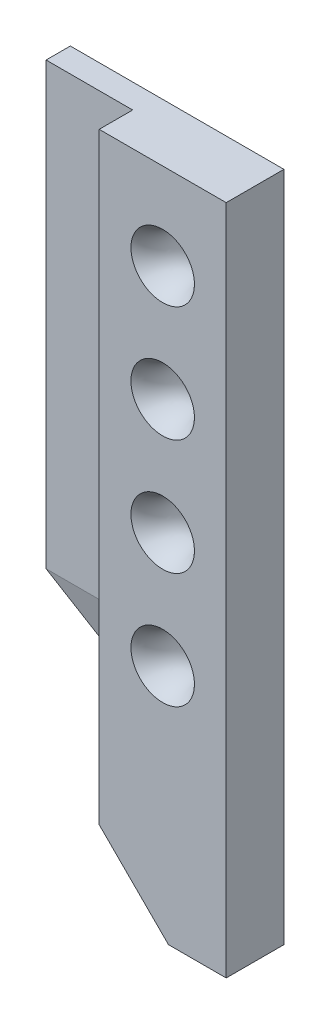
ISO-10303-21;
HEADER;
FILE_DESCRIPTION(('STEP AP214'),'2;1');
FILE_NAME('part.step','',(''),(''),'','','');
FILE_SCHEMA(('AUTOMOTIVE_DESIGN { 1 0 10303 214 1 1 1 1 }'));
ENDSEC;
DATA;
#1=APPLICATION_CONTEXT('core data for automotive mechanical design processes');
#2=APPLICATION_PROTOCOL_DEFINITION('international standard','automotive_design',2000,#1);
#3=PRODUCT_CONTEXT('',#1,'mechanical');
#4=PRODUCT('Part','Part','',(#3));
#5=PRODUCT_RELATED_PRODUCT_CATEGORY('part','',(#4));
#6=PRODUCT_DEFINITION_FORMATION('','',#4);
#7=PRODUCT_DEFINITION_CONTEXT('part definition',#1,'design');
#8=PRODUCT_DEFINITION('design','',#6,#7);
#9=PRODUCT_DEFINITION_SHAPE('','',#8);
#10=(LENGTH_UNIT() NAMED_UNIT(*) SI_UNIT(.MILLI.,.METRE.));
#11=(NAMED_UNIT(*) PLANE_ANGLE_UNIT() SI_UNIT($,.RADIAN.));
#12=(NAMED_UNIT(*) SI_UNIT($,.STERADIAN.) SOLID_ANGLE_UNIT());
#13=UNCERTAINTY_MEASURE_WITH_UNIT(LENGTH_MEASURE(1.E-05),#10,'distance_accuracy_value','');
#14=(GEOMETRIC_REPRESENTATION_CONTEXT(3) GLOBAL_UNCERTAINTY_ASSIGNED_CONTEXT((#13)) GLOBAL_UNIT_ASSIGNED_CONTEXT((#10,
#11,#12)) REPRESENTATION_CONTEXT('',''));
#15=CARTESIAN_POINT('',(0.,0.,0.));
#16=DIRECTION('',(0.,0.,1.));
#17=DIRECTION('',(1.,0.,0.));
#18=AXIS2_PLACEMENT_3D('',#15,#16,#17);
#19=CARTESIAN_POINT('',(0.,0.,0.));
#20=DIRECTION('',(0.,0.,-1.));
#21=DIRECTION('',(1.,0.,0.));
#22=AXIS2_PLACEMENT_3D('',#19,#20,#21);
#23=PLANE('',#22);
#24=DIRECTION('',(-1.,0.,0.));
#25=VECTOR('',#24,1.);
#26=CARTESIAN_POINT('',(55.6495954639596,-45.,0.));
#27=LINE('',#26,#25);
#28=CARTESIAN_POINT('',(40.2,-45.,0.));
#29=VERTEX_POINT('',#28);
#30=CARTESIAN_POINT('',(25.2,-45.,0.));
#31=VERTEX_POINT('',#30);
#32=EDGE_CURVE('E136',#29,#31,#27,.T.);
#33=ORIENTED_EDGE('',*,*,#32,.F.);
#34=DIRECTION('',(0.,1.,0.));
#35=VECTOR('',#34,1.);
#36=CARTESIAN_POINT('',(40.2,0.,0.));
#37=LINE('',#36,#35);
#38=CARTESIAN_POINT('',(40.2,31.3209195267317,0.));
#39=VERTEX_POINT('',#38);
#40=EDGE_CURVE('E11',#29,#39,#37,.T.);
#41=ORIENTED_EDGE('',*,*,#40,.T.);
#42=DIRECTION('',(-1.,0.,0.));
#43=VECTOR('',#42,1.);
#44=CARTESIAN_POINT('',(0.,31.3209195267317,0.));
#45=LINE('',#44,#43);
#46=CARTESIAN_POINT('',(25.2,31.3209195267317,0.));
#47=VERTEX_POINT('',#46);
#48=EDGE_CURVE('E138',#39,#47,#45,.T.);
#49=ORIENTED_EDGE('',*,*,#48,.T.);
#50=DIRECTION('',(0.,-1.,0.));
#51=VECTOR('',#50,1.);
#52=CARTESIAN_POINT('',(25.2,0.,0.));
#53=LINE('',#52,#51);
#54=EDGE_CURVE('E121',#47,#31,#53,.T.);
#55=ORIENTED_EDGE('',*,*,#54,.T.);
#56=EDGE_LOOP('',(#33,#41,#49,#55));
#57=FACE_BOUND('',#56,.T.);
#58=ADVANCED_FACE('F45',(#57),#23,.F.);
#59=CARTESIAN_POINT('',(-9.9,-9.9,-4.2));
#60=DIRECTION('',(0.707106781186548,0.707106781186548,0.));
#61=DIRECTION('',(-0.707106781186548,0.707106781186548,0.));
#62=AXIS2_PLACEMENT_3D('',#59,#60,#61);
#63=PLANE('',#62);
#64=DIRECTION('',(-0.696590254218819,0.696590254218819,0.171825596040642));
#65=VECTOR('',#64,1.);
#66=CARTESIAN_POINT('',(-8.3609998059048,-11.4390001940952,8.27837995212319));
#67=LINE('',#66,#65);
#68=CARTESIAN_POINT('',(40.2,-60.,-3.7));
#69=VERTEX_POINT('',#68);
#70=EDGE_CURVE('E130',#69,#31,#67,.T.);
#71=ORIENTED_EDGE('',*,*,#70,.T.);
#72=DIRECTION('',(0.,0.,1.));
#73=VECTOR('',#72,1.);
#74=CARTESIAN_POINT('',(25.2,-45.,-4.2));
#75=LINE('',#74,#73);
#76=CARTESIAN_POINT('',(25.2,-45.,-4.2));
#77=VERTEX_POINT('',#76);
#78=EDGE_CURVE('E116',#77,#31,#75,.T.);
#79=ORIENTED_EDGE('',*,*,#78,.F.);
#80=DIRECTION('',(0.707106781186548,-0.707106781186548,0.));
#81=VECTOR('',#80,1.);
#82=CARTESIAN_POINT('',(-9.9,-9.9,-4.2));
#83=LINE('',#82,#81);
#84=CARTESIAN_POINT('',(40.2,-60.,-4.2));
#85=VERTEX_POINT('',#84);
#86=EDGE_CURVE('E139',#77,#85,#83,.T.);
#87=ORIENTED_EDGE('',*,*,#86,.T.);
#88=DIRECTION('',(0.,0.,1.));
#89=VECTOR('',#88,1.);
#90=CARTESIAN_POINT('',(40.2,-60.,-4.2));
#91=LINE('',#90,#89);
#92=EDGE_CURVE('E49',#85,#69,#91,.T.);
#93=ORIENTED_EDGE('',*,*,#92,.T.);
#94=EDGE_LOOP('',(#71,#79,#87,#93));
#95=FACE_BOUND('',#94,.T.);
#96=ADVANCED_FACE('F47',(#95),#63,.F.);
#97=CARTESIAN_POINT('',(40.2,0.,-4.2));
#98=DIRECTION('',(-1.,0.,0.));
#99=DIRECTION('',(0.,0.,-1.));
#100=AXIS2_PLACEMENT_3D('',#97,#98,#99);
#101=PLANE('',#100);
#102=ORIENTED_EDGE('',*,*,#92,.F.);
#103=DIRECTION('',(0.,1.,0.));
#104=VECTOR('',#103,1.);
#105=CARTESIAN_POINT('',(40.2,0.,-4.2));
#106=LINE('',#105,#104);
#107=CARTESIAN_POINT('',(40.2,-73.0000000000001,-4.2));
#108=VERTEX_POINT('',#107);
#109=EDGE_CURVE('E170',#108,#85,#106,.T.);
#110=ORIENTED_EDGE('',*,*,#109,.F.);
#111=DIRECTION('',(0.,0.,-1.));
#112=VECTOR('',#111,1.);
#113=CARTESIAN_POINT('',(40.2,-73.0000000000001,5.801));
#114=LINE('',#113,#112);
#115=CARTESIAN_POINT('',(40.2,-73.0000000000001,5.8));
#116=VERTEX_POINT('',#115);
#117=EDGE_CURVE('E151',#116,#108,#114,.T.);
#118=ORIENTED_EDGE('',*,*,#117,.F.);
#119=DIRECTION('',(0.,1.,0.));
#120=VECTOR('',#119,1.);
#121=CARTESIAN_POINT('',(40.2,0.,5.8));
#122=LINE('',#121,#120);
#123=CARTESIAN_POINT('',(40.2,31.3209195267317,5.8));
#124=VERTEX_POINT('',#123);
#125=EDGE_CURVE('E156',#116,#124,#122,.T.);
#126=ORIENTED_EDGE('',*,*,#125,.T.);
#127=DIRECTION('',(0.,0.,-1.));
#128=VECTOR('',#127,1.);
#129=CARTESIAN_POINT('',(40.2,31.3209195267317,5.8));
#130=LINE('',#129,#128);
#131=EDGE_CURVE('E166',#124,#39,#130,.T.);
#132=ORIENTED_EDGE('',*,*,#131,.T.);
#133=ORIENTED_EDGE('',*,*,#40,.F.);
#134=DIRECTION('',(0.,0.970899208007849,0.239488471308603));
#135=VECTOR('',#134,1.);
#136=CARTESIAN_POINT('',(40.2,-2.58096275503791,10.463362520424));
#137=LINE('',#136,#135);
#138=EDGE_CURVE('E61',#69,#29,#137,.T.);
#139=ORIENTED_EDGE('',*,*,#138,.F.);
#140=EDGE_LOOP('',(#102,#110,#118,#126,#132,#133,#139));
#141=FACE_BOUND('',#140,.T.);
#142=ADVANCED_FACE('F206',(#141),#101,.T.);
#143=CARTESIAN_POINT('',(0.,-85.,-4.2));
#144=DIRECTION('',(0.,1.,0.));
#145=DIRECTION('',(0.,0.,-1.));
#146=AXIS2_PLACEMENT_3D('',#143,#144,#145);
#147=PLANE('',#146);
#148=DIRECTION('',(1.,0.,0.));
#149=VECTOR('',#148,1.);
#150=CARTESIAN_POINT('',(0.,-85.,-4.2));
#151=LINE('',#150,#149);
#152=CARTESIAN_POINT('',(52.2,-85.,-4.2));
#153=VERTEX_POINT('',#152);
#154=CARTESIAN_POINT('',(62.2,-85.,-4.2));
#155=VERTEX_POINT('',#154);
#156=EDGE_CURVE('E172',#153,#155,#151,.T.);
#157=ORIENTED_EDGE('',*,*,#156,.T.);
#158=DIRECTION('',(0.,0.,1.));
#159=VECTOR('',#158,1.);
#160=CARTESIAN_POINT('',(62.2,-85.,-4.2));
#161=LINE('',#160,#159);
#162=CARTESIAN_POINT('',(62.2,-85.,5.8));
#163=VERTEX_POINT('',#162);
#164=EDGE_CURVE('E186',#155,#163,#161,.T.);
#165=ORIENTED_EDGE('',*,*,#164,.T.);
#166=DIRECTION('',(1.,0.,0.));
#167=VECTOR('',#166,1.);
#168=CARTESIAN_POINT('',(0.,-85.,5.8));
#169=LINE('',#168,#167);
#170=CARTESIAN_POINT('',(52.2,-85.,5.8));
#171=VERTEX_POINT('',#170);
#172=EDGE_CURVE('E159',#171,#163,#169,.T.);
#173=ORIENTED_EDGE('',*,*,#172,.F.);
#174=DIRECTION('',(0.,0.,-1.));
#175=VECTOR('',#174,1.);
#176=CARTESIAN_POINT('',(52.2,-85.,5.801));
#177=LINE('',#176,#175);
#178=EDGE_CURVE('E150',#171,#153,#177,.T.);
#179=ORIENTED_EDGE('',*,*,#178,.T.);
#180=EDGE_LOOP('',(#157,#165,#173,#179));
#181=FACE_BOUND('',#180,.T.);
#182=ADVANCED_FACE('F191',(#181),#147,.F.);
#183=CARTESIAN_POINT('',(62.2,0.,-4.2));
#184=DIRECTION('',(-1.,0.,0.));
#185=DIRECTION('',(0.,0.,-1.));
#186=AXIS2_PLACEMENT_3D('',#183,#184,#185);
#187=PLANE('',#186);
#188=ORIENTED_EDGE('',*,*,#164,.F.);
#189=DIRECTION('',(0.,1.,0.));
#190=VECTOR('',#189,1.);
#191=CARTESIAN_POINT('',(62.2,0.,-4.2));
#192=LINE('',#191,#190);
#193=CARTESIAN_POINT('',(62.2,31.3209195267317,-4.2));
#194=VERTEX_POINT('',#193);
#195=EDGE_CURVE('E175',#155,#194,#192,.T.);
#196=ORIENTED_EDGE('',*,*,#195,.T.);
#197=DIRECTION('',(0.,0.,1.));
#198=VECTOR('',#197,1.);
#199=CARTESIAN_POINT('',(62.2,31.3209195267317,-4.2));
#200=LINE('',#199,#198);
#201=CARTESIAN_POINT('',(62.2,31.3209195267317,5.8));
#202=VERTEX_POINT('',#201);
#203=EDGE_CURVE('E184',#194,#202,#200,.T.);
#204=ORIENTED_EDGE('',*,*,#203,.T.);
#205=DIRECTION('',(0.,1.,0.));
#206=VECTOR('',#205,1.);
#207=CARTESIAN_POINT('',(62.2,0.,5.8));
#208=LINE('',#207,#206);
#209=EDGE_CURVE('E162',#163,#202,#208,.T.);
#210=ORIENTED_EDGE('',*,*,#209,.F.);
#211=EDGE_LOOP('',(#188,#196,#204,#210));
#212=FACE_BOUND('',#211,.T.);
#213=ADVANCED_FACE('F194',(#212),#187,.F.);
#214=CARTESIAN_POINT('',(0.,31.3209195267317,-4.2));
#215=DIRECTION('',(0.,-1.,0.));
#216=DIRECTION('',(0.,0.,1.));
#217=AXIS2_PLACEMENT_3D('',#214,#215,#216);
#218=PLANE('',#217);
#219=ORIENTED_EDGE('',*,*,#203,.F.);
#220=DIRECTION('',(-1.,0.,0.));
#221=VECTOR('',#220,1.);
#222=CARTESIAN_POINT('',(0.,31.3209195267317,-4.2));
#223=LINE('',#222,#221);
#224=CARTESIAN_POINT('',(25.2,31.3209195267317,-4.2));
#225=VERTEX_POINT('',#224);
#226=EDGE_CURVE('E178',#194,#225,#223,.T.);
#227=ORIENTED_EDGE('',*,*,#226,.T.);
#228=DIRECTION('',(0.,0.,1.));
#229=VECTOR('',#228,1.);
#230=CARTESIAN_POINT('',(25.2,31.3209195267317,-4.2));
#231=LINE('',#230,#229);
#232=EDGE_CURVE('E127',#225,#47,#231,.T.);
#233=ORIENTED_EDGE('',*,*,#232,.T.);
#234=ORIENTED_EDGE('',*,*,#48,.F.);
#235=ORIENTED_EDGE('',*,*,#131,.F.);
#236=DIRECTION('',(-1.,0.,0.));
#237=VECTOR('',#236,1.);
#238=CARTESIAN_POINT('',(0.,31.3209195267317,5.8));
#239=LINE('',#238,#237);
#240=EDGE_CURVE('E165',#202,#124,#239,.T.);
#241=ORIENTED_EDGE('',*,*,#240,.F.);
#242=EDGE_LOOP('',(#219,#227,#233,#234,#235,#241));
#243=FACE_BOUND('',#242,.T.);
#244=ADVANCED_FACE('F203',(#243),#218,.F.);
#245=CARTESIAN_POINT('',(25.2,0.,-4.2));
#246=DIRECTION('',(1.,0.,0.));
#247=DIRECTION('',(0.,1.,0.));
#248=AXIS2_PLACEMENT_3D('',#245,#246,#247);
#249=PLANE('',#248);
#250=ORIENTED_EDGE('',*,*,#54,.F.);
#251=ORIENTED_EDGE('',*,*,#232,.F.);
#252=DIRECTION('',(0.,-1.,0.));
#253=VECTOR('',#252,1.);
#254=CARTESIAN_POINT('',(25.2,0.,-4.2));
#255=LINE('',#254,#253);
#256=EDGE_CURVE('E123',#225,#77,#255,.T.);
#257=ORIENTED_EDGE('',*,*,#256,.T.);
#258=ORIENTED_EDGE('',*,*,#78,.T.);
#259=EDGE_LOOP('',(#250,#251,#257,#258));
#260=FACE_BOUND('',#259,.T.);
#261=ADVANCED_FACE('F118',(#260),#249,.F.);
#262=CARTESIAN_POINT('',(0.,0.,-4.2));
#263=DIRECTION('',(0.,0.,-1.));
#264=DIRECTION('',(1.,0.,0.));
#265=AXIS2_PLACEMENT_3D('',#262,#263,#264);
#266=PLANE('',#265);
#267=CARTESIAN_POINT('',(51.2,-43.6790804732683,-4.2));
#268=DIRECTION('',(0.,0.,-1.));
#269=DIRECTION('',(-1.,0.,0.));
#270=AXIS2_PLACEMENT_3D('',#267,#268,#269);
#271=CIRCLE('',#270,5.5);
#272=CARTESIAN_POINT('',(45.7,-43.6790804732683,-4.2));
#273=VERTEX_POINT('',#272);
#274=EDGE_CURVE('E378',#273,#273,#271,.T.);
#275=ORIENTED_EDGE('',*,*,#274,.F.);
#276=EDGE_LOOP('',(#275));
#277=FACE_BOUND('',#276,.T.);
#278=CARTESIAN_POINT('',(51.2,-23.6790804732683,-4.2));
#279=DIRECTION('',(0.,0.,-1.));
#280=DIRECTION('',(-1.,0.,0.));
#281=AXIS2_PLACEMENT_3D('',#278,#279,#280);
#282=CIRCLE('',#281,5.5);
#283=CARTESIAN_POINT('',(45.7,-23.6790804732683,-4.2));
#284=VERTEX_POINT('',#283);
#285=EDGE_CURVE('E388',#284,#284,#282,.T.);
#286=ORIENTED_EDGE('',*,*,#285,.F.);
#287=EDGE_LOOP('',(#286));
#288=FACE_BOUND('',#287,.T.);
#289=CARTESIAN_POINT('',(51.2,-3.67908047326834,-4.2));
#290=DIRECTION('',(0.,0.,-1.));
#291=DIRECTION('',(-1.,0.,0.));
#292=AXIS2_PLACEMENT_3D('',#289,#290,#291);
#293=CIRCLE('',#292,5.5);
#294=CARTESIAN_POINT('',(45.7,-3.67908047326834,-4.2));
#295=VERTEX_POINT('',#294);
#296=EDGE_CURVE('E394',#295,#295,#293,.T.);
#297=ORIENTED_EDGE('',*,*,#296,.F.);
#298=EDGE_LOOP('',(#297));
#299=FACE_BOUND('',#298,.T.);
#300=CARTESIAN_POINT('',(51.2,16.3209195267317,-4.2));
#301=DIRECTION('',(0.,0.,-1.));
#302=DIRECTION('',(-1.,0.,0.));
#303=AXIS2_PLACEMENT_3D('',#300,#301,#302);
#304=CIRCLE('',#303,5.5);
#305=CARTESIAN_POINT('',(45.7,16.3209195267317,-4.2));
#306=VERTEX_POINT('',#305);
#307=EDGE_CURVE('E142',#306,#306,#304,.T.);
#308=ORIENTED_EDGE('',*,*,#307,.F.);
#309=EDGE_LOOP('',(#308));
#310=FACE_BOUND('',#309,.T.);
#311=DIRECTION('',(-0.707106781186551,0.707106781186544,0.));
#312=VECTOR('',#311,1.);
#313=CARTESIAN_POINT('',(52.2,-85.,-4.2));
#314=LINE('',#313,#312);
#315=EDGE_CURVE('E132',#153,#108,#314,.T.);
#316=ORIENTED_EDGE('',*,*,#315,.T.);
#317=ORIENTED_EDGE('',*,*,#109,.T.);
#318=ORIENTED_EDGE('',*,*,#86,.F.);
#319=ORIENTED_EDGE('',*,*,#256,.F.);
#320=ORIENTED_EDGE('',*,*,#226,.F.);
#321=ORIENTED_EDGE('',*,*,#195,.F.);
#322=ORIENTED_EDGE('',*,*,#156,.F.);
#323=EDGE_LOOP('',(#316,#317,#318,#319,#320,#321,#322));
#324=FACE_BOUND('',#323,.T.);
#325=ADVANCED_FACE('F201',(#277,#288,#299,#310,#324),#266,.T.);
#326=CARTESIAN_POINT('',(0.,0.,5.8));
#327=DIRECTION('',(0.,0.,-1.));
#328=DIRECTION('',(1.,0.,0.));
#329=AXIS2_PLACEMENT_3D('',#326,#327,#328);
#330=PLANE('',#329);
#331=CARTESIAN_POINT('',(51.2,-43.6790804732683,5.8));
#332=DIRECTION('',(0.,0.,-1.));
#333=DIRECTION('',(-1.,0.,0.));
#334=AXIS2_PLACEMENT_3D('',#331,#332,#333);
#335=CIRCLE('',#334,5.5);
#336=CARTESIAN_POINT('',(45.7,-43.6790804732683,5.8));
#337=VERTEX_POINT('',#336);
#338=EDGE_CURVE('E381',#337,#337,#335,.T.);
#339=ORIENTED_EDGE('',*,*,#338,.T.);
#340=EDGE_LOOP('',(#339));
#341=FACE_BOUND('',#340,.T.);
#342=CARTESIAN_POINT('',(51.2,-23.6790804732683,5.8));
#343=DIRECTION('',(0.,0.,-1.));
#344=DIRECTION('',(-1.,0.,0.));
#345=AXIS2_PLACEMENT_3D('',#342,#343,#344);
#346=CIRCLE('',#345,5.5);
#347=CARTESIAN_POINT('',(45.7,-23.6790804732683,5.8));
#348=VERTEX_POINT('',#347);
#349=EDGE_CURVE('E383',#348,#348,#346,.T.);
#350=ORIENTED_EDGE('',*,*,#349,.T.);
#351=EDGE_LOOP('',(#350));
#352=FACE_BOUND('',#351,.T.);
#353=CARTESIAN_POINT('',(51.2,-3.67908047326834,5.8));
#354=DIRECTION('',(0.,0.,-1.));
#355=DIRECTION('',(-1.,0.,0.));
#356=AXIS2_PLACEMENT_3D('',#353,#354,#355);
#357=CIRCLE('',#356,5.5);
#358=CARTESIAN_POINT('',(45.7,-3.67908047326834,5.8));
#359=VERTEX_POINT('',#358);
#360=EDGE_CURVE('E391',#359,#359,#357,.T.);
#361=ORIENTED_EDGE('',*,*,#360,.T.);
#362=EDGE_LOOP('',(#361));
#363=FACE_BOUND('',#362,.T.);
#364=CARTESIAN_POINT('',(51.2,16.3209195267317,5.8));
#365=DIRECTION('',(0.,0.,-1.));
#366=DIRECTION('',(-1.,0.,0.));
#367=AXIS2_PLACEMENT_3D('',#364,#365,#366);
#368=CIRCLE('',#367,5.5);
#369=CARTESIAN_POINT('',(45.7,16.3209195267317,5.8));
#370=VERTEX_POINT('',#369);
#371=EDGE_CURVE('E146',#370,#370,#368,.T.);
#372=ORIENTED_EDGE('',*,*,#371,.T.);
#373=EDGE_LOOP('',(#372));
#374=FACE_BOUND('',#373,.T.);
#375=ORIENTED_EDGE('',*,*,#172,.T.);
#376=ORIENTED_EDGE('',*,*,#209,.T.);
#377=ORIENTED_EDGE('',*,*,#240,.T.);
#378=ORIENTED_EDGE('',*,*,#125,.F.);
#379=DIRECTION('',(0.707106781186551,-0.707106781186544,0.));
#380=VECTOR('',#379,1.);
#381=CARTESIAN_POINT('',(52.2,-85.,5.8));
#382=LINE('',#381,#380);
#383=EDGE_CURVE('E69',#116,#171,#382,.T.);
#384=ORIENTED_EDGE('',*,*,#383,.T.);
#385=EDGE_LOOP('',(#375,#376,#377,#378,#384));
#386=FACE_BOUND('',#385,.T.);
#387=ADVANCED_FACE('F197',(#341,#352,#363,#374,#386),#330,.F.);
#388=CARTESIAN_POINT('',(52.2,-85.,5.801));
#389=DIRECTION('',(0.707106781186544,0.707106781186551,0.));
#390=DIRECTION('',(-0.707106781186551,0.707106781186544,0.));
#391=AXIS2_PLACEMENT_3D('',#388,#389,#390);
#392=PLANE('',#391);
#393=ORIENTED_EDGE('',*,*,#383,.F.);
#394=ORIENTED_EDGE('',*,*,#117,.T.);
#395=ORIENTED_EDGE('',*,*,#315,.F.);
#396=ORIENTED_EDGE('',*,*,#178,.F.);
#397=EDGE_LOOP('',(#393,#394,#395,#396));
#398=FACE_BOUND('',#397,.T.);
#399=ADVANCED_FACE('F199',(#398),#392,.F.);
#400=CARTESIAN_POINT('',(55.6495954639596,-2.58096275503791,10.463362520424));
#401=DIRECTION('',(0.,-0.239488471308603,0.970899208007849));
#402=DIRECTION('',(0.,0.970899208007849,0.239488471308603));
#403=AXIS2_PLACEMENT_3D('',#400,#401,#402);
#404=PLANE('',#403);
#405=ORIENTED_EDGE('',*,*,#70,.F.);
#406=ORIENTED_EDGE('',*,*,#138,.T.);
#407=ORIENTED_EDGE('',*,*,#32,.T.);
#408=EDGE_LOOP('',(#405,#406,#407));
#409=FACE_BOUND('',#408,.T.);
#410=ADVANCED_FACE('F141',(#409),#404,.T.);
#411=CARTESIAN_POINT('',(51.2,16.3209195267317,0.799999999999999));
#412=DIRECTION('',(0.,0.,1.));
#413=DIRECTION('',(-1.,0.,0.));
#414=AXIS2_PLACEMENT_3D('',#411,#412,#413);
#415=TOROIDAL_SURFACE('',#414,10.75,7.25);
#416=ORIENTED_EDGE('',*,*,#307,.T.);
#417=EDGE_LOOP('',(#416));
#418=FACE_BOUND('',#417,.T.);
#419=ORIENTED_EDGE('',*,*,#371,.F.);
#420=EDGE_LOOP('',(#419));
#421=FACE_BOUND('',#420,.T.);
#422=ADVANCED_FACE('F268',(#418,#421),#415,.T.);
#423=CARTESIAN_POINT('',(51.2,-3.67908047326834,0.799999999999999));
#424=DIRECTION('',(0.,0.,1.));
#425=DIRECTION('',(-1.,0.,0.));
#426=AXIS2_PLACEMENT_3D('',#423,#424,#425);
#427=TOROIDAL_SURFACE('',#426,10.75,7.25);
#428=ORIENTED_EDGE('',*,*,#296,.T.);
#429=EDGE_LOOP('',(#428));
#430=FACE_BOUND('',#429,.T.);
#431=ORIENTED_EDGE('',*,*,#360,.F.);
#432=EDGE_LOOP('',(#431));
#433=FACE_BOUND('',#432,.T.);
#434=ADVANCED_FACE('F277',(#430,#433),#427,.T.);
#435=CARTESIAN_POINT('',(51.2,-23.6790804732683,0.799999999999999));
#436=DIRECTION('',(0.,0.,1.));
#437=DIRECTION('',(-1.,0.,0.));
#438=AXIS2_PLACEMENT_3D('',#435,#436,#437);
#439=TOROIDAL_SURFACE('',#438,10.75,7.25);
#440=ORIENTED_EDGE('',*,*,#285,.T.);
#441=EDGE_LOOP('',(#440));
#442=FACE_BOUND('',#441,.T.);
#443=ORIENTED_EDGE('',*,*,#349,.F.);
#444=EDGE_LOOP('',(#443));
#445=FACE_BOUND('',#444,.T.);
#446=ADVANCED_FACE('F286',(#442,#445),#439,.T.);
#447=CARTESIAN_POINT('',(51.2,-43.6790804732683,0.799999999999999));
#448=DIRECTION('',(0.,0.,1.));
#449=DIRECTION('',(-1.,0.,0.));
#450=AXIS2_PLACEMENT_3D('',#447,#448,#449);
#451=TOROIDAL_SURFACE('',#450,10.75,7.25);
#452=ORIENTED_EDGE('',*,*,#274,.T.);
#453=EDGE_LOOP('',(#452));
#454=FACE_BOUND('',#453,.T.);
#455=ORIENTED_EDGE('',*,*,#338,.F.);
#456=EDGE_LOOP('',(#455));
#457=FACE_BOUND('',#456,.T.);
#458=ADVANCED_FACE('F295',(#454,#457),#451,.T.);
#459=CLOSED_SHELL('',(#58,#96,#142,#182,#213,#244,#261,#325,#387,#399,#410,#422,#434,#446,#458));
#460=MANIFOLD_SOLID_BREP('B2',#459);
#461=ADVANCED_BREP_SHAPE_REPRESENTATION('',(#18,#460),#14);
#462=SHAPE_DEFINITION_REPRESENTATION(#9,#461);
ENDSEC;
END-ISO-10303-21;
